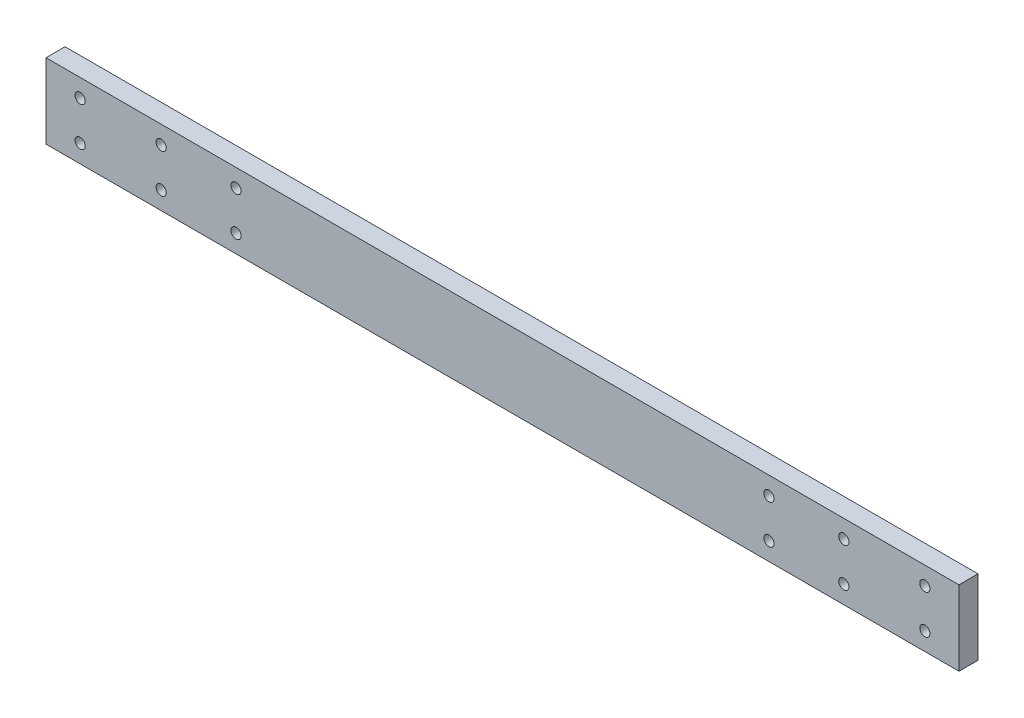
ISO-10303-21;
HEADER;
FILE_DESCRIPTION(('STEP AP214'),'2;1');
FILE_NAME('part.step','',(''),(''),'','','');
FILE_SCHEMA(('AUTOMOTIVE_DESIGN { 1 0 10303 214 1 1 1 1 }'));
ENDSEC;
DATA;
#1=APPLICATION_CONTEXT('core data for automotive mechanical design processes');
#2=APPLICATION_PROTOCOL_DEFINITION('international standard','automotive_design',2000,#1);
#3=PRODUCT_CONTEXT('',#1,'mechanical');
#4=PRODUCT('Part','Part','',(#3));
#5=PRODUCT_RELATED_PRODUCT_CATEGORY('part','',(#4));
#6=PRODUCT_DEFINITION_FORMATION('','',#4);
#7=PRODUCT_DEFINITION_CONTEXT('part definition',#1,'design');
#8=PRODUCT_DEFINITION('design','',#6,#7);
#9=PRODUCT_DEFINITION_SHAPE('','',#8);
#10=(LENGTH_UNIT() NAMED_UNIT(*) SI_UNIT(.MILLI.,.METRE.));
#11=(NAMED_UNIT(*) PLANE_ANGLE_UNIT() SI_UNIT($,.RADIAN.));
#12=(NAMED_UNIT(*) SI_UNIT($,.STERADIAN.) SOLID_ANGLE_UNIT());
#13=UNCERTAINTY_MEASURE_WITH_UNIT(LENGTH_MEASURE(1.E-05),#10,'distance_accuracy_value','');
#14=(GEOMETRIC_REPRESENTATION_CONTEXT(3) GLOBAL_UNCERTAINTY_ASSIGNED_CONTEXT((#13)) GLOBAL_UNIT_ASSIGNED_CONTEXT((#10,
#11,#12)) REPRESENTATION_CONTEXT('',''));
#15=CARTESIAN_POINT('',(0.,0.,0.));
#16=DIRECTION('',(0.,0.,1.));
#17=DIRECTION('',(1.,0.,0.));
#18=AXIS2_PLACEMENT_3D('',#15,#16,#17);
#19=CARTESIAN_POINT('',(264.023766162715,0.,6.35));
#20=DIRECTION('',(1.,0.,0.));
#21=DIRECTION('',(0.,0.,-1.));
#22=AXIS2_PLACEMENT_3D('',#19,#20,#21);
#23=PLANE('',#22);
#24=DIRECTION('',(0.,-1.,0.));
#25=VECTOR('',#24,1.);
#26=CARTESIAN_POINT('',(264.023766162715,0.,0.));
#27=LINE('',#26,#25);
#28=CARTESIAN_POINT('',(264.023766162715,235.923622409626,0.));
#29=VERTEX_POINT('',#28);
#30=CARTESIAN_POINT('',(264.023766162715,210.923622409626,0.));
#31=VERTEX_POINT('',#30);
#32=EDGE_CURVE('E103',#29,#31,#27,.T.);
#33=ORIENTED_EDGE('',*,*,#32,.F.);
#34=DIRECTION('',(0.,0.,-1.));
#35=VECTOR('',#34,1.);
#36=CARTESIAN_POINT('',(264.023766162715,235.923622409626,6.35));
#37=LINE('',#36,#35);
#38=CARTESIAN_POINT('',(264.023766162715,235.923622409626,6.35));
#39=VERTEX_POINT('',#38);
#40=EDGE_CURVE('E11',#39,#29,#37,.T.);
#41=ORIENTED_EDGE('',*,*,#40,.F.);
#42=DIRECTION('',(0.,-1.,0.));
#43=VECTOR('',#42,1.);
#44=CARTESIAN_POINT('',(264.023766162715,0.,6.35));
#45=LINE('',#44,#43);
#46=CARTESIAN_POINT('',(264.023766162715,210.923622409626,6.35));
#47=VERTEX_POINT('',#46);
#48=EDGE_CURVE('E96',#39,#47,#45,.T.);
#49=ORIENTED_EDGE('',*,*,#48,.T.);
#50=DIRECTION('',(0.,0.,-1.));
#51=VECTOR('',#50,1.);
#52=CARTESIAN_POINT('',(264.023766162715,210.923622409626,6.35));
#53=LINE('',#52,#51);
#54=EDGE_CURVE('E76',#47,#31,#53,.T.);
#55=ORIENTED_EDGE('',*,*,#54,.T.);
#56=EDGE_LOOP('',(#33,#41,#49,#55));
#57=FACE_BOUND('',#56,.T.);
#58=ADVANCED_FACE('F36',(#57),#23,.T.);
#59=CARTESIAN_POINT('',(0.,235.923622409626,6.35));
#60=DIRECTION('',(0.,1.,0.));
#61=DIRECTION('',(0.,0.,1.));
#62=AXIS2_PLACEMENT_3D('',#59,#60,#61);
#63=PLANE('',#62);
#64=DIRECTION('',(1.,0.,0.));
#65=VECTOR('',#64,1.);
#66=CARTESIAN_POINT('',(0.,235.923622409626,0.));
#67=LINE('',#66,#65);
#68=CARTESIAN_POINT('',(-40.7762338372855,235.923622409626,0.));
#69=VERTEX_POINT('',#68);
#70=EDGE_CURVE('E89',#69,#29,#67,.T.);
#71=ORIENTED_EDGE('',*,*,#70,.F.);
#72=DIRECTION('',(0.,0.,-1.));
#73=VECTOR('',#72,1.);
#74=CARTESIAN_POINT('',(-40.7762338372855,235.923622409626,6.35));
#75=LINE('',#74,#73);
#76=CARTESIAN_POINT('',(-40.7762338372855,235.923622409626,6.35));
#77=VERTEX_POINT('',#76);
#78=EDGE_CURVE('E45',#77,#69,#75,.T.);
#79=ORIENTED_EDGE('',*,*,#78,.F.);
#80=DIRECTION('',(1.,0.,0.));
#81=VECTOR('',#80,1.);
#82=CARTESIAN_POINT('',(0.,235.923622409626,6.35));
#83=LINE('',#82,#81);
#84=EDGE_CURVE('E87',#77,#39,#83,.T.);
#85=ORIENTED_EDGE('',*,*,#84,.T.);
#86=ORIENTED_EDGE('',*,*,#40,.T.);
#87=EDGE_LOOP('',(#71,#79,#85,#86));
#88=FACE_BOUND('',#87,.T.);
#89=ADVANCED_FACE('F85',(#88),#63,.T.);
#90=CARTESIAN_POINT('',(-40.7762338372855,0.,6.35));
#91=DIRECTION('',(1.,0.,0.));
#92=DIRECTION('',(0.,0.,-1.));
#93=AXIS2_PLACEMENT_3D('',#90,#91,#92);
#94=PLANE('',#93);
#95=DIRECTION('',(0.,-1.,0.));
#96=VECTOR('',#95,1.);
#97=CARTESIAN_POINT('',(-40.7762338372855,0.,0.));
#98=LINE('',#97,#96);
#99=CARTESIAN_POINT('',(-40.7762338372855,210.923622409626,0.));
#100=VERTEX_POINT('',#99);
#101=EDGE_CURVE('E69',#69,#100,#98,.T.);
#102=ORIENTED_EDGE('',*,*,#101,.T.);
#103=DIRECTION('',(0.,0.,-1.));
#104=VECTOR('',#103,1.);
#105=CARTESIAN_POINT('',(-40.7762338372855,210.923622409626,6.35));
#106=LINE('',#105,#104);
#107=CARTESIAN_POINT('',(-40.7762338372855,210.923622409626,6.35));
#108=VERTEX_POINT('',#107);
#109=EDGE_CURVE('E90',#108,#100,#106,.T.);
#110=ORIENTED_EDGE('',*,*,#109,.F.);
#111=DIRECTION('',(0.,-1.,0.));
#112=VECTOR('',#111,1.);
#113=CARTESIAN_POINT('',(-40.7762338372855,0.,6.35));
#114=LINE('',#113,#112);
#115=EDGE_CURVE('E92',#77,#108,#114,.T.);
#116=ORIENTED_EDGE('',*,*,#115,.F.);
#117=ORIENTED_EDGE('',*,*,#78,.T.);
#118=EDGE_LOOP('',(#102,#110,#116,#117));
#119=FACE_BOUND('',#118,.T.);
#120=ADVANCED_FACE('F93',(#119),#94,.F.);
#121=CARTESIAN_POINT('',(0.,210.923622409626,6.35));
#122=DIRECTION('',(0.,1.,0.));
#123=DIRECTION('',(0.,0.,1.));
#124=AXIS2_PLACEMENT_3D('',#121,#122,#123);
#125=PLANE('',#124);
#126=DIRECTION('',(1.,0.,0.));
#127=VECTOR('',#126,1.);
#128=CARTESIAN_POINT('',(0.,210.923622409626,0.));
#129=LINE('',#128,#127);
#130=EDGE_CURVE('E98',#100,#31,#129,.T.);
#131=ORIENTED_EDGE('',*,*,#130,.T.);
#132=ORIENTED_EDGE('',*,*,#54,.F.);
#133=DIRECTION('',(1.,0.,0.));
#134=VECTOR('',#133,1.);
#135=CARTESIAN_POINT('',(0.,210.923622409626,6.35));
#136=LINE('',#135,#134);
#137=EDGE_CURVE('E54',#108,#47,#136,.T.);
#138=ORIENTED_EDGE('',*,*,#137,.F.);
#139=ORIENTED_EDGE('',*,*,#109,.T.);
#140=EDGE_LOOP('',(#131,#132,#138,#139));
#141=FACE_BOUND('',#140,.T.);
#142=ADVANCED_FACE('F182',(#141),#125,.F.);
#143=CARTESIAN_POINT('',(0.,0.,6.35));
#144=DIRECTION('',(0.,0.,1.));
#145=DIRECTION('',(1.,0.,0.));
#146=AXIS2_PLACEMENT_3D('',#143,#144,#145);
#147=PLANE('',#146);
#148=CARTESIAN_POINT('',(22.6737661624925,229.923622409214,6.35));
#149=DIRECTION('',(0.,0.,1.));
#150=DIRECTION('',(1.,0.,0.));
#151=AXIS2_PLACEMENT_3D('',#148,#149,#150);
#152=CIRCLE('',#151,1.7);
#153=CARTESIAN_POINT('',(24.3737661624925,229.923622409214,6.35));
#154=VERTEX_POINT('',#153);
#155=EDGE_CURVE('E343',#154,#154,#152,.T.);
#156=ORIENTED_EDGE('',*,*,#155,.F.);
#157=EDGE_LOOP('',(#156));
#158=FACE_BOUND('',#157,.T.);
#159=CARTESIAN_POINT('',(200.573766162366,216.923622410467,6.35));
#160=DIRECTION('',(0.,0.,1.));
#161=DIRECTION('',(1.,0.,0.));
#162=AXIS2_PLACEMENT_3D('',#159,#160,#161);
#163=CIRCLE('',#162,1.69999999999999);
#164=CARTESIAN_POINT('',(202.273766162366,216.923622410467,6.35));
#165=VERTEX_POINT('',#164);
#166=EDGE_CURVE('E344',#165,#165,#163,.T.);
#167=ORIENTED_EDGE('',*,*,#166,.F.);
#168=EDGE_LOOP('',(#167));
#169=FACE_BOUND('',#168,.T.);
#170=CARTESIAN_POINT('',(200.573766162366,229.923622410467,6.35));
#171=DIRECTION('',(0.,0.,1.));
#172=DIRECTION('',(1.,0.,0.));
#173=AXIS2_PLACEMENT_3D('',#170,#171,#172);
#174=CIRCLE('',#173,1.69999999999999);
#175=CARTESIAN_POINT('',(202.273766162366,229.923622410467,6.35));
#176=VERTEX_POINT('',#175);
#177=EDGE_CURVE('E348',#176,#176,#174,.T.);
#178=ORIENTED_EDGE('',*,*,#177,.F.);
#179=EDGE_LOOP('',(#178));
#180=FACE_BOUND('',#179,.T.);
#181=CARTESIAN_POINT('',(22.6737661624925,216.923622409214,6.35));
#182=DIRECTION('',(0.,0.,1.));
#183=DIRECTION('',(1.,0.,0.));
#184=AXIS2_PLACEMENT_3D('',#181,#182,#183);
#185=CIRCLE('',#184,1.7);
#186=CARTESIAN_POINT('',(24.3737661624925,216.923622409214,6.35));
#187=VERTEX_POINT('',#186);
#188=EDGE_CURVE('E140',#187,#187,#185,.T.);
#189=ORIENTED_EDGE('',*,*,#188,.F.);
#190=EDGE_LOOP('',(#189));
#191=FACE_BOUND('',#190,.T.);
#192=CARTESIAN_POINT('',(252.623766162366,229.92362241078,6.35));
#193=DIRECTION('',(0.,0.,1.));
#194=DIRECTION('',(1.,0.,0.));
#195=AXIS2_PLACEMENT_3D('',#192,#193,#194);
#196=CIRCLE('',#195,1.69999999999996);
#197=CARTESIAN_POINT('',(254.323766162366,229.92362241078,6.35));
#198=VERTEX_POINT('',#197);
#199=EDGE_CURVE('E162',#198,#198,#196,.T.);
#200=ORIENTED_EDGE('',*,*,#199,.F.);
#201=EDGE_LOOP('',(#200));
#202=FACE_BOUND('',#201,.T.);
#203=CARTESIAN_POINT('',(-29.3762338375199,216.923622410265,6.35));
#204=DIRECTION('',(0.,0.,1.));
#205=DIRECTION('',(1.,0.,0.));
#206=AXIS2_PLACEMENT_3D('',#203,#204,#205);
#207=CIRCLE('',#206,1.69999999999998);
#208=CARTESIAN_POINT('',(-27.6762338375199,216.923622410265,6.35));
#209=VERTEX_POINT('',#208);
#210=EDGE_CURVE('E164',#209,#209,#207,.T.);
#211=ORIENTED_EDGE('',*,*,#210,.F.);
#212=EDGE_LOOP('',(#211));
#213=FACE_BOUND('',#212,.T.);
#214=CARTESIAN_POINT('',(-29.3762338375198,229.923622410266,6.35));
#215=DIRECTION('',(0.,0.,1.));
#216=DIRECTION('',(1.,0.,0.));
#217=AXIS2_PLACEMENT_3D('',#214,#215,#216);
#218=CIRCLE('',#217,1.69999999999998);
#219=CARTESIAN_POINT('',(-27.6762338375198,229.923622410266,6.35));
#220=VERTEX_POINT('',#219);
#221=EDGE_CURVE('E167',#220,#220,#218,.T.);
#222=ORIENTED_EDGE('',*,*,#221,.F.);
#223=EDGE_LOOP('',(#222));
#224=FACE_BOUND('',#223,.T.);
#225=CARTESIAN_POINT('',(-2.32623383751829,216.923622409221,6.35));
#226=DIRECTION('',(0.,0.,1.));
#227=DIRECTION('',(1.,0.,0.));
#228=AXIS2_PLACEMENT_3D('',#225,#226,#227);
#229=CIRCLE('',#228,1.69999999999998);
#230=CARTESIAN_POINT('',(-0.626233837518305,216.923622409221,6.35));
#231=VERTEX_POINT('',#230);
#232=EDGE_CURVE('E170',#231,#231,#229,.T.);
#233=ORIENTED_EDGE('',*,*,#232,.F.);
#234=EDGE_LOOP('',(#233));
#235=FACE_BOUND('',#234,.T.);
#236=CARTESIAN_POINT('',(225.573766162366,216.923622410467,6.35));
#237=DIRECTION('',(0.,0.,1.));
#238=DIRECTION('',(1.,0.,0.));
#239=AXIS2_PLACEMENT_3D('',#236,#237,#238);
#240=CIRCLE('',#239,1.69999999999999);
#241=CARTESIAN_POINT('',(227.273766162366,216.923622410467,6.35));
#242=VERTEX_POINT('',#241);
#243=EDGE_CURVE('E147',#242,#242,#240,.T.);
#244=ORIENTED_EDGE('',*,*,#243,.F.);
#245=EDGE_LOOP('',(#244));
#246=FACE_BOUND('',#245,.T.);
#247=CARTESIAN_POINT('',(225.573766162366,229.923622410467,6.35));
#248=DIRECTION('',(0.,0.,1.));
#249=DIRECTION('',(1.,0.,0.));
#250=AXIS2_PLACEMENT_3D('',#247,#248,#249);
#251=CIRCLE('',#250,1.69999999999999);
#252=CARTESIAN_POINT('',(227.273766162366,229.923622410467,6.35));
#253=VERTEX_POINT('',#252);
#254=EDGE_CURVE('E151',#253,#253,#251,.T.);
#255=ORIENTED_EDGE('',*,*,#254,.F.);
#256=EDGE_LOOP('',(#255));
#257=FACE_BOUND('',#256,.T.);
#258=CARTESIAN_POINT('',(252.623766162365,216.92362241078,6.35));
#259=DIRECTION('',(0.,0.,1.));
#260=DIRECTION('',(1.,0.,0.));
#261=AXIS2_PLACEMENT_3D('',#258,#259,#260);
#262=CIRCLE('',#261,1.69999999999996);
#263=CARTESIAN_POINT('',(254.323766162365,216.92362241078,6.35));
#264=VERTEX_POINT('',#263);
#265=EDGE_CURVE('E156',#264,#264,#262,.T.);
#266=ORIENTED_EDGE('',*,*,#265,.F.);
#267=EDGE_LOOP('',(#266));
#268=FACE_BOUND('',#267,.T.);
#269=CARTESIAN_POINT('',(-2.32623383751829,229.923622409221,6.35));
#270=DIRECTION('',(0.,0.,1.));
#271=DIRECTION('',(1.,0.,0.));
#272=AXIS2_PLACEMENT_3D('',#269,#270,#271);
#273=CIRCLE('',#272,1.69999999999998);
#274=CARTESIAN_POINT('',(-0.626233837518305,229.923622409221,6.35));
#275=VERTEX_POINT('',#274);
#276=EDGE_CURVE('E116',#275,#275,#273,.T.);
#277=ORIENTED_EDGE('',*,*,#276,.F.);
#278=EDGE_LOOP('',(#277));
#279=FACE_BOUND('',#278,.T.);
#280=ORIENTED_EDGE('',*,*,#48,.F.);
#281=ORIENTED_EDGE('',*,*,#84,.F.);
#282=ORIENTED_EDGE('',*,*,#115,.T.);
#283=ORIENTED_EDGE('',*,*,#137,.T.);
#284=EDGE_LOOP('',(#280,#281,#282,#283));
#285=FACE_BOUND('',#284,.T.);
#286=ADVANCED_FACE('F95',(#158,#169,#180,#191,#202,#213,#224,#235,#246,#257,#268,#279,#285),
#147,.T.);
#287=CARTESIAN_POINT('',(0.,0.,0.));
#288=DIRECTION('',(0.,0.,1.));
#289=DIRECTION('',(1.,0.,0.));
#290=AXIS2_PLACEMENT_3D('',#287,#288,#289);
#291=PLANE('',#290);
#292=CARTESIAN_POINT('',(22.6737661624925,229.923622409214,0.));
#293=DIRECTION('',(0.,0.,1.));
#294=DIRECTION('',(1.,0.,0.));
#295=AXIS2_PLACEMENT_3D('',#292,#293,#294);
#296=CIRCLE('',#295,1.7);
#297=CARTESIAN_POINT('',(24.3737661624925,229.923622409214,0.));
#298=VERTEX_POINT('',#297);
#299=EDGE_CURVE('E39',#298,#298,#296,.T.);
#300=ORIENTED_EDGE('',*,*,#299,.T.);
#301=EDGE_LOOP('',(#300));
#302=FACE_BOUND('',#301,.T.);
#303=CARTESIAN_POINT('',(200.573766162366,216.923622410467,0.));
#304=DIRECTION('',(0.,0.,1.));
#305=DIRECTION('',(1.,0.,0.));
#306=AXIS2_PLACEMENT_3D('',#303,#304,#305);
#307=CIRCLE('',#306,1.69999999999999);
#308=CARTESIAN_POINT('',(202.273766162366,216.923622410467,0.));
#309=VERTEX_POINT('',#308);
#310=EDGE_CURVE('E142',#309,#309,#307,.T.);
#311=ORIENTED_EDGE('',*,*,#310,.T.);
#312=EDGE_LOOP('',(#311));
#313=FACE_BOUND('',#312,.T.);
#314=CARTESIAN_POINT('',(200.573766162366,229.923622410467,0.));
#315=DIRECTION('',(0.,0.,1.));
#316=DIRECTION('',(1.,0.,0.));
#317=AXIS2_PLACEMENT_3D('',#314,#315,#316);
#318=CIRCLE('',#317,1.69999999999999);
#319=CARTESIAN_POINT('',(202.273766162366,229.923622410467,0.));
#320=VERTEX_POINT('',#319);
#321=EDGE_CURVE('E139',#320,#320,#318,.T.);
#322=ORIENTED_EDGE('',*,*,#321,.T.);
#323=EDGE_LOOP('',(#322));
#324=FACE_BOUND('',#323,.T.);
#325=CARTESIAN_POINT('',(22.6737661624925,216.923622409214,0.));
#326=DIRECTION('',(0.,0.,1.));
#327=DIRECTION('',(1.,0.,0.));
#328=AXIS2_PLACEMENT_3D('',#325,#326,#327);
#329=CIRCLE('',#328,1.7);
#330=CARTESIAN_POINT('',(24.3737661624925,216.923622409214,0.));
#331=VERTEX_POINT('',#330);
#332=EDGE_CURVE('E136',#331,#331,#329,.T.);
#333=ORIENTED_EDGE('',*,*,#332,.T.);
#334=EDGE_LOOP('',(#333));
#335=FACE_BOUND('',#334,.T.);
#336=CARTESIAN_POINT('',(252.623766162366,229.92362241078,0.));
#337=DIRECTION('',(0.,0.,1.));
#338=DIRECTION('',(1.,0.,0.));
#339=AXIS2_PLACEMENT_3D('',#336,#337,#338);
#340=CIRCLE('',#339,1.69999999999996);
#341=CARTESIAN_POINT('',(254.323766162366,229.92362241078,0.));
#342=VERTEX_POINT('',#341);
#343=EDGE_CURVE('E106',#342,#342,#340,.T.);
#344=ORIENTED_EDGE('',*,*,#343,.T.);
#345=EDGE_LOOP('',(#344));
#346=FACE_BOUND('',#345,.T.);
#347=CARTESIAN_POINT('',(-29.3762338375199,216.923622410265,0.));
#348=DIRECTION('',(0.,0.,1.));
#349=DIRECTION('',(1.,0.,0.));
#350=AXIS2_PLACEMENT_3D('',#347,#348,#349);
#351=CIRCLE('',#350,1.69999999999998);
#352=CARTESIAN_POINT('',(-27.6762338375199,216.923622410265,0.));
#353=VERTEX_POINT('',#352);
#354=EDGE_CURVE('E131',#353,#353,#351,.T.);
#355=ORIENTED_EDGE('',*,*,#354,.T.);
#356=EDGE_LOOP('',(#355));
#357=FACE_BOUND('',#356,.T.);
#358=CARTESIAN_POINT('',(-29.3762338375198,229.923622410266,0.));
#359=DIRECTION('',(0.,0.,1.));
#360=DIRECTION('',(1.,0.,0.));
#361=AXIS2_PLACEMENT_3D('',#358,#359,#360);
#362=CIRCLE('',#361,1.69999999999998);
#363=CARTESIAN_POINT('',(-27.6762338375198,229.923622410266,0.));
#364=VERTEX_POINT('',#363);
#365=EDGE_CURVE('E128',#364,#364,#362,.T.);
#366=ORIENTED_EDGE('',*,*,#365,.T.);
#367=EDGE_LOOP('',(#366));
#368=FACE_BOUND('',#367,.T.);
#369=CARTESIAN_POINT('',(-2.32623383751829,216.923622409221,0.));
#370=DIRECTION('',(0.,0.,1.));
#371=DIRECTION('',(1.,0.,0.));
#372=AXIS2_PLACEMENT_3D('',#369,#370,#371);
#373=CIRCLE('',#372,1.69999999999998);
#374=CARTESIAN_POINT('',(-0.626233837518305,216.923622409221,0.));
#375=VERTEX_POINT('',#374);
#376=EDGE_CURVE('E125',#375,#375,#373,.T.);
#377=ORIENTED_EDGE('',*,*,#376,.T.);
#378=EDGE_LOOP('',(#377));
#379=FACE_BOUND('',#378,.T.);
#380=CARTESIAN_POINT('',(225.573766162366,216.923622410467,0.));
#381=DIRECTION('',(0.,0.,1.));
#382=DIRECTION('',(1.,0.,0.));
#383=AXIS2_PLACEMENT_3D('',#380,#381,#382);
#384=CIRCLE('',#383,1.69999999999999);
#385=CARTESIAN_POINT('',(227.273766162366,216.923622410467,0.));
#386=VERTEX_POINT('',#385);
#387=EDGE_CURVE('E122',#386,#386,#384,.T.);
#388=ORIENTED_EDGE('',*,*,#387,.T.);
#389=EDGE_LOOP('',(#388));
#390=FACE_BOUND('',#389,.T.);
#391=CARTESIAN_POINT('',(225.573766162366,229.923622410467,0.));
#392=DIRECTION('',(0.,0.,1.));
#393=DIRECTION('',(1.,0.,0.));
#394=AXIS2_PLACEMENT_3D('',#391,#392,#393);
#395=CIRCLE('',#394,1.69999999999999);
#396=CARTESIAN_POINT('',(227.273766162366,229.923622410467,0.));
#397=VERTEX_POINT('',#396);
#398=EDGE_CURVE('E119',#397,#397,#395,.T.);
#399=ORIENTED_EDGE('',*,*,#398,.T.);
#400=EDGE_LOOP('',(#399));
#401=FACE_BOUND('',#400,.T.);
#402=CARTESIAN_POINT('',(252.623766162365,216.92362241078,0.));
#403=DIRECTION('',(0.,0.,1.));
#404=DIRECTION('',(1.,0.,0.));
#405=AXIS2_PLACEMENT_3D('',#402,#403,#404);
#406=CIRCLE('',#405,1.69999999999996);
#407=CARTESIAN_POINT('',(254.323766162365,216.92362241078,0.));
#408=VERTEX_POINT('',#407);
#409=EDGE_CURVE('E115',#408,#408,#406,.T.);
#410=ORIENTED_EDGE('',*,*,#409,.T.);
#411=EDGE_LOOP('',(#410));
#412=FACE_BOUND('',#411,.T.);
#413=CARTESIAN_POINT('',(-2.32623383751829,229.923622409221,0.));
#414=DIRECTION('',(0.,0.,1.));
#415=DIRECTION('',(1.,0.,0.));
#416=AXIS2_PLACEMENT_3D('',#413,#414,#415);
#417=CIRCLE('',#416,1.69999999999998);
#418=CARTESIAN_POINT('',(-0.626233837518305,229.923622409221,0.));
#419=VERTEX_POINT('',#418);
#420=EDGE_CURVE('E112',#419,#419,#417,.T.);
#421=ORIENTED_EDGE('',*,*,#420,.T.);
#422=EDGE_LOOP('',(#421));
#423=FACE_BOUND('',#422,.T.);
#424=ORIENTED_EDGE('',*,*,#32,.T.);
#425=ORIENTED_EDGE('',*,*,#130,.F.);
#426=ORIENTED_EDGE('',*,*,#101,.F.);
#427=ORIENTED_EDGE('',*,*,#70,.T.);
#428=EDGE_LOOP('',(#424,#425,#426,#427));
#429=FACE_BOUND('',#428,.T.);
#430=ADVANCED_FACE('F181',(#302,#313,#324,#335,#346,#357,#368,#379,#390,#401,#412,#423,#429),
#291,.F.);
#431=CARTESIAN_POINT('',(-2.32623383751829,229.923622409221,-23.65));
#432=DIRECTION('',(0.,0.,1.));
#433=DIRECTION('',(1.,0.,0.));
#434=AXIS2_PLACEMENT_3D('',#431,#432,#433);
#435=CYLINDRICAL_SURFACE('',#434,1.69999999999998);
#436=ORIENTED_EDGE('',*,*,#276,.T.);
#437=EDGE_LOOP('',(#436));
#438=FACE_BOUND('',#437,.T.);
#439=ORIENTED_EDGE('',*,*,#420,.F.);
#440=EDGE_LOOP('',(#439));
#441=FACE_BOUND('',#440,.T.);
#442=ADVANCED_FACE('F177',(#438,#441),#435,.F.);
#443=CARTESIAN_POINT('',(252.623766162365,216.92362241078,-23.65));
#444=DIRECTION('',(0.,0.,1.));
#445=DIRECTION('',(1.,0.,0.));
#446=AXIS2_PLACEMENT_3D('',#443,#444,#445);
#447=CYLINDRICAL_SURFACE('',#446,1.69999999999996);
#448=ORIENTED_EDGE('',*,*,#265,.T.);
#449=EDGE_LOOP('',(#448));
#450=FACE_BOUND('',#449,.T.);
#451=ORIENTED_EDGE('',*,*,#409,.F.);
#452=EDGE_LOOP('',(#451));
#453=FACE_BOUND('',#452,.T.);
#454=ADVANCED_FACE('F221',(#450,#453),#447,.F.);
#455=CARTESIAN_POINT('',(225.573766162366,229.923622410467,-23.65));
#456=DIRECTION('',(0.,0.,1.));
#457=DIRECTION('',(1.,0.,0.));
#458=AXIS2_PLACEMENT_3D('',#455,#456,#457);
#459=CYLINDRICAL_SURFACE('',#458,1.69999999999999);
#460=ORIENTED_EDGE('',*,*,#254,.T.);
#461=EDGE_LOOP('',(#460));
#462=FACE_BOUND('',#461,.T.);
#463=ORIENTED_EDGE('',*,*,#398,.F.);
#464=EDGE_LOOP('',(#463));
#465=FACE_BOUND('',#464,.T.);
#466=ADVANCED_FACE('F230',(#462,#465),#459,.F.);
#467=CARTESIAN_POINT('',(225.573766162366,216.923622410467,-23.65));
#468=DIRECTION('',(0.,0.,1.));
#469=DIRECTION('',(1.,0.,0.));
#470=AXIS2_PLACEMENT_3D('',#467,#468,#469);
#471=CYLINDRICAL_SURFACE('',#470,1.69999999999999);
#472=ORIENTED_EDGE('',*,*,#243,.T.);
#473=EDGE_LOOP('',(#472));
#474=FACE_BOUND('',#473,.T.);
#475=ORIENTED_EDGE('',*,*,#387,.F.);
#476=EDGE_LOOP('',(#475));
#477=FACE_BOUND('',#476,.T.);
#478=ADVANCED_FACE('F240',(#474,#477),#471,.F.);
#479=CARTESIAN_POINT('',(-2.32623383751829,216.923622409221,-23.65));
#480=DIRECTION('',(0.,0.,1.));
#481=DIRECTION('',(1.,0.,0.));
#482=AXIS2_PLACEMENT_3D('',#479,#480,#481);
#483=CYLINDRICAL_SURFACE('',#482,1.69999999999998);
#484=ORIENTED_EDGE('',*,*,#232,.T.);
#485=EDGE_LOOP('',(#484));
#486=FACE_BOUND('',#485,.T.);
#487=ORIENTED_EDGE('',*,*,#376,.F.);
#488=EDGE_LOOP('',(#487));
#489=FACE_BOUND('',#488,.T.);
#490=ADVANCED_FACE('F250',(#486,#489),#483,.F.);
#491=CARTESIAN_POINT('',(-29.3762338375198,229.923622410266,-23.65));
#492=DIRECTION('',(0.,0.,1.));
#493=DIRECTION('',(1.,0.,0.));
#494=AXIS2_PLACEMENT_3D('',#491,#492,#493);
#495=CYLINDRICAL_SURFACE('',#494,1.69999999999998);
#496=ORIENTED_EDGE('',*,*,#221,.T.);
#497=EDGE_LOOP('',(#496));
#498=FACE_BOUND('',#497,.T.);
#499=ORIENTED_EDGE('',*,*,#365,.F.);
#500=EDGE_LOOP('',(#499));
#501=FACE_BOUND('',#500,.T.);
#502=ADVANCED_FACE('F259',(#498,#501),#495,.F.);
#503=CARTESIAN_POINT('',(-29.3762338375199,216.923622410265,-23.65));
#504=DIRECTION('',(0.,0.,1.));
#505=DIRECTION('',(1.,0.,0.));
#506=AXIS2_PLACEMENT_3D('',#503,#504,#505);
#507=CYLINDRICAL_SURFACE('',#506,1.69999999999998);
#508=ORIENTED_EDGE('',*,*,#210,.T.);
#509=EDGE_LOOP('',(#508));
#510=FACE_BOUND('',#509,.T.);
#511=ORIENTED_EDGE('',*,*,#354,.F.);
#512=EDGE_LOOP('',(#511));
#513=FACE_BOUND('',#512,.T.);
#514=ADVANCED_FACE('F269',(#510,#513),#507,.F.);
#515=CARTESIAN_POINT('',(252.623766162366,229.92362241078,-23.65));
#516=DIRECTION('',(0.,0.,1.));
#517=DIRECTION('',(1.,0.,0.));
#518=AXIS2_PLACEMENT_3D('',#515,#516,#517);
#519=CYLINDRICAL_SURFACE('',#518,1.69999999999996);
#520=ORIENTED_EDGE('',*,*,#199,.T.);
#521=EDGE_LOOP('',(#520));
#522=FACE_BOUND('',#521,.T.);
#523=ORIENTED_EDGE('',*,*,#343,.F.);
#524=EDGE_LOOP('',(#523));
#525=FACE_BOUND('',#524,.T.);
#526=ADVANCED_FACE('F279',(#522,#525),#519,.F.);
#527=CARTESIAN_POINT('',(22.6737661624925,216.923622409214,-14.65));
#528=DIRECTION('',(0.,0.,1.));
#529=DIRECTION('',(1.,0.,0.));
#530=AXIS2_PLACEMENT_3D('',#527,#528,#529);
#531=CYLINDRICAL_SURFACE('',#530,1.7);
#532=CARTESIAN_POINT('',(24.3737661624925,216.923622409214,6.35));
#533=CARTESIAN_POINT('',(24.3737661624925,216.923622409214,6.28385416666667));
#534=CARTESIAN_POINT('',(24.3737661624925,216.923622409214,6.21770833333333));
#535=CARTESIAN_POINT('',(24.3737661624925,216.923622409214,6.08541666666667));
#536=CARTESIAN_POINT('',(24.3737661624925,216.923622409214,6.01927083333333));
#537=CARTESIAN_POINT('',(24.3737661624925,216.923622409214,5.88697916666667));
#538=CARTESIAN_POINT('',(24.3737661624925,216.923622409214,5.82083333333333));
#539=CARTESIAN_POINT('',(24.3737661624925,216.923622409214,5.68854166666667));
#540=CARTESIAN_POINT('',(24.3737661624925,216.923622409214,5.62239583333333));
#541=CARTESIAN_POINT('',(24.3737661624925,216.923622409214,5.49010416666667));
#542=CARTESIAN_POINT('',(24.3737661624925,216.923622409214,5.42395833333333));
#543=CARTESIAN_POINT('',(24.3737661624925,216.923622409214,5.29166666666667));
#544=CARTESIAN_POINT('',(24.3737661624925,216.923622409214,5.22552083333333));
#545=CARTESIAN_POINT('',(24.3737661624925,216.923622409214,5.09322916666667));
#546=CARTESIAN_POINT('',(24.3737661624925,216.923622409214,5.02708333333333));
#547=CARTESIAN_POINT('',(24.3737661624925,216.923622409214,4.89479166666667));
#548=CARTESIAN_POINT('',(24.3737661624925,216.923622409214,4.82864583333333));
#549=CARTESIAN_POINT('',(24.3737661624925,216.923622409214,4.69635416666667));
#550=CARTESIAN_POINT('',(24.3737661624925,216.923622409214,4.63020833333333));
#551=CARTESIAN_POINT('',(24.3737661624925,216.923622409214,4.49791666666667));
#552=CARTESIAN_POINT('',(24.3737661624925,216.923622409214,4.43177083333333));
#553=CARTESIAN_POINT('',(24.3737661624925,216.923622409214,4.29947916666667));
#554=CARTESIAN_POINT('',(24.3737661624925,216.923622409214,4.23333333333333));
#555=CARTESIAN_POINT('',(24.3737661624925,216.923622409214,4.10104166666667));
#556=CARTESIAN_POINT('',(24.3737661624925,216.923622409214,4.03489583333333));
#557=CARTESIAN_POINT('',(24.3737661624925,216.923622409214,3.90260416666667));
#558=CARTESIAN_POINT('',(24.3737661624925,216.923622409214,3.83645833333333));
#559=CARTESIAN_POINT('',(24.3737661624925,216.923622409214,3.70416666666667));
#560=CARTESIAN_POINT('',(24.3737661624925,216.923622409214,3.63802083333333));
#561=CARTESIAN_POINT('',(24.3737661624925,216.923622409214,3.50572916666667));
#562=CARTESIAN_POINT('',(24.3737661624925,216.923622409214,3.43958333333333));
#563=CARTESIAN_POINT('',(24.3737661624925,216.923622409214,3.30729166666667));
#564=CARTESIAN_POINT('',(24.3737661624925,216.923622409214,3.24114583333333));
#565=CARTESIAN_POINT('',(24.3737661624925,216.923622409214,3.10885416666667));
#566=CARTESIAN_POINT('',(24.3737661624925,216.923622409214,3.04270833333333));
#567=CARTESIAN_POINT('',(24.3737661624925,216.923622409214,2.91041666666667));
#568=CARTESIAN_POINT('',(24.3737661624925,216.923622409214,2.84427083333333));
#569=CARTESIAN_POINT('',(24.3737661624925,216.923622409214,2.71197916666666));
#570=CARTESIAN_POINT('',(24.3737661624925,216.923622409214,2.64583333333333));
#571=CARTESIAN_POINT('',(24.3737661624925,216.923622409214,2.51354166666667));
#572=CARTESIAN_POINT('',(24.3737661624925,216.923622409214,2.44739583333333));
#573=CARTESIAN_POINT('',(24.3737661624925,216.923622409214,2.31510416666667));
#574=CARTESIAN_POINT('',(24.3737661624925,216.923622409214,2.24895833333333));
#575=CARTESIAN_POINT('',(24.3737661624925,216.923622409214,2.11666666666666));
#576=CARTESIAN_POINT('',(24.3737661624925,216.923622409214,2.05052083333333));
#577=CARTESIAN_POINT('',(24.3737661624925,216.923622409214,1.91822916666667));
#578=CARTESIAN_POINT('',(24.3737661624925,216.923622409214,1.85208333333333));
#579=CARTESIAN_POINT('',(24.3737661624925,216.923622409214,1.71979166666667));
#580=CARTESIAN_POINT('',(24.3737661624925,216.923622409214,1.65364583333333));
#581=CARTESIAN_POINT('',(24.3737661624925,216.923622409214,1.52135416666666));
#582=CARTESIAN_POINT('',(24.3737661624925,216.923622409214,1.45520833333333));
#583=CARTESIAN_POINT('',(24.3737661624925,216.923622409214,1.32291666666666));
#584=CARTESIAN_POINT('',(24.3737661624925,216.923622409214,1.25677083333333));
#585=CARTESIAN_POINT('',(24.3737661624925,216.923622409214,1.12447916666666));
#586=CARTESIAN_POINT('',(24.3737661624925,216.923622409214,1.05833333333333));
#587=CARTESIAN_POINT('',(24.3737661624925,216.923622409214,0.926041666666664));
#588=CARTESIAN_POINT('',(24.3737661624925,216.923622409214,0.859895833333332));
#589=CARTESIAN_POINT('',(24.3737661624925,216.923622409214,0.727604166666666));
#590=CARTESIAN_POINT('',(24.3737661624925,216.923622409214,0.661458333333333));
#591=CARTESIAN_POINT('',(24.3737661624925,216.923622409214,0.529166666666667));
#592=CARTESIAN_POINT('',(24.3737661624925,216.923622409214,0.463020833333333));
#593=CARTESIAN_POINT('',(24.3737661624925,216.923622409214,0.330729166666666));
#594=CARTESIAN_POINT('',(24.3737661624925,216.923622409214,0.264583333333333));
#595=CARTESIAN_POINT('',(24.3737661624925,216.923622409214,0.132291666666666));
#596=CARTESIAN_POINT('',(24.3737661624925,216.923622409214,0.066145833333333));
#597=CARTESIAN_POINT('',(24.3737661624925,216.923622409214,0.));
#598=B_SPLINE_CURVE_WITH_KNOTS('',3,(#532,#533,#534,#535,#536,#537,#538,#539,#540,#541,#542,
#543,#544,#545,#546,#547,#548,#549,#550,#551,#552,#553,#554,#555,#556,#557,#558,#559,#560,#561,
#562,#563,#564,#565,#566,#567,#568,#569,#570,#571,#572,#573,#574,#575,#576,#577,#578,#579,#580,
#581,#582,#583,#584,#585,#586,#587,#588,#589,#590,#591,#592,#593,#594,#595,#596,#597),
.UNSPECIFIED.,.F.,.F.,(4,2,2,2,2,2,2,2,2,2,2,2,2,2,2,2,2,2,2,2,2,2,2,2,2,2,2,2,2,2,2,2,4),(0.,
0.198437499999999,0.396875000000001,0.5953125,0.793749999999999,0.992187500000002,1.190625,
1.3890625,1.5875,1.7859375,1.984375,2.1828125,2.38125,2.5796875,2.778125,2.9765625,3.175,
3.3734375,3.571875,3.7703125,3.96875,4.1671875,4.365625,4.5640625,4.7625,4.9609375,5.159375,
5.3578125,5.55625,5.7546875,5.953125,6.1515625,6.35),.UNSPECIFIED.);
#599=EDGE_CURVE('BSEAM288',#187,#331,#598,.T.);
#600=ORIENTED_EDGE('',*,*,#188,.T.);
#601=ORIENTED_EDGE('',*,*,#332,.F.);
#602=ORIENTED_EDGE('',*,*,#599,.T.);
#603=ORIENTED_EDGE('',*,*,#599,.F.);
#604=EDGE_LOOP('',(#600,#602,#601,#603));
#605=FACE_BOUND('',#604,.T.);
#606=ADVANCED_FACE('F288',(#605),#531,.F.);
#607=CARTESIAN_POINT('',(200.573766162366,229.923622410467,-14.65));
#608=DIRECTION('',(0.,0.,1.));
#609=DIRECTION('',(1.,0.,0.));
#610=AXIS2_PLACEMENT_3D('',#607,#608,#609);
#611=CYLINDRICAL_SURFACE('',#610,1.69999999999999);
#612=CARTESIAN_POINT('',(202.273766162366,229.923622410467,6.35));
#613=CARTESIAN_POINT('',(202.273766162366,229.923622410467,6.28385416666667));
#614=CARTESIAN_POINT('',(202.273766162366,229.923622410467,6.21770833333333));
#615=CARTESIAN_POINT('',(202.273766162366,229.923622410467,6.08541666666667));
#616=CARTESIAN_POINT('',(202.273766162366,229.923622410467,6.01927083333333));
#617=CARTESIAN_POINT('',(202.273766162366,229.923622410467,5.88697916666667));
#618=CARTESIAN_POINT('',(202.273766162366,229.923622410467,5.82083333333333));
#619=CARTESIAN_POINT('',(202.273766162366,229.923622410467,5.68854166666667));
#620=CARTESIAN_POINT('',(202.273766162366,229.923622410467,5.62239583333333));
#621=CARTESIAN_POINT('',(202.273766162366,229.923622410467,5.49010416666667));
#622=CARTESIAN_POINT('',(202.273766162366,229.923622410467,5.42395833333333));
#623=CARTESIAN_POINT('',(202.273766162366,229.923622410467,5.29166666666667));
#624=CARTESIAN_POINT('',(202.273766162366,229.923622410467,5.22552083333333));
#625=CARTESIAN_POINT('',(202.273766162366,229.923622410467,5.09322916666667));
#626=CARTESIAN_POINT('',(202.273766162366,229.923622410467,5.02708333333333));
#627=CARTESIAN_POINT('',(202.273766162366,229.923622410467,4.89479166666667));
#628=CARTESIAN_POINT('',(202.273766162366,229.923622410467,4.82864583333333));
#629=CARTESIAN_POINT('',(202.273766162366,229.923622410467,4.69635416666667));
#630=CARTESIAN_POINT('',(202.273766162366,229.923622410467,4.63020833333333));
#631=CARTESIAN_POINT('',(202.273766162366,229.923622410467,4.49791666666667));
#632=CARTESIAN_POINT('',(202.273766162366,229.923622410467,4.43177083333333));
#633=CARTESIAN_POINT('',(202.273766162366,229.923622410467,4.29947916666667));
#634=CARTESIAN_POINT('',(202.273766162366,229.923622410467,4.23333333333333));
#635=CARTESIAN_POINT('',(202.273766162366,229.923622410467,4.10104166666667));
#636=CARTESIAN_POINT('',(202.273766162366,229.923622410467,4.03489583333333));
#637=CARTESIAN_POINT('',(202.273766162366,229.923622410467,3.90260416666667));
#638=CARTESIAN_POINT('',(202.273766162366,229.923622410467,3.83645833333333));
#639=CARTESIAN_POINT('',(202.273766162366,229.923622410467,3.70416666666667));
#640=CARTESIAN_POINT('',(202.273766162366,229.923622410467,3.63802083333333));
#641=CARTESIAN_POINT('',(202.273766162366,229.923622410467,3.50572916666667));
#642=CARTESIAN_POINT('',(202.273766162366,229.923622410467,3.43958333333333));
#643=CARTESIAN_POINT('',(202.273766162366,229.923622410467,3.30729166666667));
#644=CARTESIAN_POINT('',(202.273766162366,229.923622410467,3.24114583333333));
#645=CARTESIAN_POINT('',(202.273766162366,229.923622410467,3.10885416666667));
#646=CARTESIAN_POINT('',(202.273766162366,229.923622410467,3.04270833333333));
#647=CARTESIAN_POINT('',(202.273766162366,229.923622410467,2.91041666666667));
#648=CARTESIAN_POINT('',(202.273766162366,229.923622410467,2.84427083333333));
#649=CARTESIAN_POINT('',(202.273766162366,229.923622410467,2.71197916666666));
#650=CARTESIAN_POINT('',(202.273766162366,229.923622410467,2.64583333333333));
#651=CARTESIAN_POINT('',(202.273766162366,229.923622410467,2.51354166666667));
#652=CARTESIAN_POINT('',(202.273766162366,229.923622410467,2.44739583333333));
#653=CARTESIAN_POINT('',(202.273766162366,229.923622410467,2.31510416666667));
#654=CARTESIAN_POINT('',(202.273766162366,229.923622410467,2.24895833333333));
#655=CARTESIAN_POINT('',(202.273766162366,229.923622410467,2.11666666666666));
#656=CARTESIAN_POINT('',(202.273766162366,229.923622410467,2.05052083333333));
#657=CARTESIAN_POINT('',(202.273766162366,229.923622410467,1.91822916666667));
#658=CARTESIAN_POINT('',(202.273766162366,229.923622410467,1.85208333333333));
#659=CARTESIAN_POINT('',(202.273766162366,229.923622410467,1.71979166666667));
#660=CARTESIAN_POINT('',(202.273766162366,229.923622410467,1.65364583333333));
#661=CARTESIAN_POINT('',(202.273766162366,229.923622410467,1.52135416666666));
#662=CARTESIAN_POINT('',(202.273766162366,229.923622410467,1.45520833333333));
#663=CARTESIAN_POINT('',(202.273766162366,229.923622410467,1.32291666666666));
#664=CARTESIAN_POINT('',(202.273766162366,229.923622410467,1.25677083333333));
#665=CARTESIAN_POINT('',(202.273766162366,229.923622410467,1.12447916666666));
#666=CARTESIAN_POINT('',(202.273766162366,229.923622410467,1.05833333333333));
#667=CARTESIAN_POINT('',(202.273766162366,229.923622410467,0.926041666666664));
#668=CARTESIAN_POINT('',(202.273766162366,229.923622410467,0.859895833333332));
#669=CARTESIAN_POINT('',(202.273766162366,229.923622410467,0.727604166666666));
#670=CARTESIAN_POINT('',(202.273766162366,229.923622410467,0.661458333333333));
#671=CARTESIAN_POINT('',(202.273766162366,229.923622410467,0.529166666666667));
#672=CARTESIAN_POINT('',(202.273766162366,229.923622410467,0.463020833333333));
#673=CARTESIAN_POINT('',(202.273766162366,229.923622410467,0.330729166666666));
#674=CARTESIAN_POINT('',(202.273766162366,229.923622410467,0.264583333333333));
#675=CARTESIAN_POINT('',(202.273766162366,229.923622410467,0.132291666666666));
#676=CARTESIAN_POINT('',(202.273766162366,229.923622410467,0.066145833333333));
#677=CARTESIAN_POINT('',(202.273766162366,229.923622410467,0.));
#678=B_SPLINE_CURVE_WITH_KNOTS('',3,(#612,#613,#614,#615,#616,#617,#618,#619,#620,#621,#622,
#623,#624,#625,#626,#627,#628,#629,#630,#631,#632,#633,#634,#635,#636,#637,#638,#639,#640,#641,
#642,#643,#644,#645,#646,#647,#648,#649,#650,#651,#652,#653,#654,#655,#656,#657,#658,#659,#660,
#661,#662,#663,#664,#665,#666,#667,#668,#669,#670,#671,#672,#673,#674,#675,#676,#677),
.UNSPECIFIED.,.F.,.F.,(4,2,2,2,2,2,2,2,2,2,2,2,2,2,2,2,2,2,2,2,2,2,2,2,2,2,2,2,2,2,2,2,4),(0.,
0.198437499999999,0.396875000000001,0.5953125,0.793749999999999,0.992187500000002,1.190625,
1.3890625,1.5875,1.7859375,1.984375,2.1828125,2.38125,2.5796875,2.778125,2.9765625,3.175,
3.3734375,3.571875,3.7703125,3.96875,4.1671875,4.365625,4.5640625,4.7625,4.9609375,5.159375,
5.3578125,5.55625,5.7546875,5.953125,6.1515625,6.35),.UNSPECIFIED.);
#679=EDGE_CURVE('BSEAM307',#176,#320,#678,.T.);
#680=ORIENTED_EDGE('',*,*,#177,.T.);
#681=ORIENTED_EDGE('',*,*,#321,.F.);
#682=ORIENTED_EDGE('',*,*,#679,.T.);
#683=ORIENTED_EDGE('',*,*,#679,.F.);
#684=EDGE_LOOP('',(#680,#682,#681,#683));
#685=FACE_BOUND('',#684,.T.);
#686=ADVANCED_FACE('F307',(#685),#611,.F.);
#687=CARTESIAN_POINT('',(200.573766162366,216.923622410467,-14.65));
#688=DIRECTION('',(0.,0.,1.));
#689=DIRECTION('',(1.,0.,0.));
#690=AXIS2_PLACEMENT_3D('',#687,#688,#689);
#691=CYLINDRICAL_SURFACE('',#690,1.69999999999999);
#692=CARTESIAN_POINT('',(202.273766162366,216.923622410467,6.35));
#693=CARTESIAN_POINT('',(202.273766162366,216.923622410467,6.28385416666667));
#694=CARTESIAN_POINT('',(202.273766162366,216.923622410467,6.21770833333333));
#695=CARTESIAN_POINT('',(202.273766162366,216.923622410467,6.08541666666667));
#696=CARTESIAN_POINT('',(202.273766162366,216.923622410467,6.01927083333333));
#697=CARTESIAN_POINT('',(202.273766162366,216.923622410467,5.88697916666667));
#698=CARTESIAN_POINT('',(202.273766162366,216.923622410467,5.82083333333333));
#699=CARTESIAN_POINT('',(202.273766162366,216.923622410467,5.68854166666667));
#700=CARTESIAN_POINT('',(202.273766162366,216.923622410467,5.62239583333333));
#701=CARTESIAN_POINT('',(202.273766162366,216.923622410467,5.49010416666667));
#702=CARTESIAN_POINT('',(202.273766162366,216.923622410467,5.42395833333333));
#703=CARTESIAN_POINT('',(202.273766162366,216.923622410467,5.29166666666667));
#704=CARTESIAN_POINT('',(202.273766162366,216.923622410467,5.22552083333333));
#705=CARTESIAN_POINT('',(202.273766162366,216.923622410467,5.09322916666667));
#706=CARTESIAN_POINT('',(202.273766162366,216.923622410467,5.02708333333333));
#707=CARTESIAN_POINT('',(202.273766162366,216.923622410467,4.89479166666667));
#708=CARTESIAN_POINT('',(202.273766162366,216.923622410467,4.82864583333333));
#709=CARTESIAN_POINT('',(202.273766162366,216.923622410467,4.69635416666667));
#710=CARTESIAN_POINT('',(202.273766162366,216.923622410467,4.63020833333333));
#711=CARTESIAN_POINT('',(202.273766162366,216.923622410467,4.49791666666667));
#712=CARTESIAN_POINT('',(202.273766162366,216.923622410467,4.43177083333333));
#713=CARTESIAN_POINT('',(202.273766162366,216.923622410467,4.29947916666667));
#714=CARTESIAN_POINT('',(202.273766162366,216.923622410467,4.23333333333333));
#715=CARTESIAN_POINT('',(202.273766162366,216.923622410467,4.10104166666667));
#716=CARTESIAN_POINT('',(202.273766162366,216.923622410467,4.03489583333333));
#717=CARTESIAN_POINT('',(202.273766162366,216.923622410467,3.90260416666667));
#718=CARTESIAN_POINT('',(202.273766162366,216.923622410467,3.83645833333333));
#719=CARTESIAN_POINT('',(202.273766162366,216.923622410467,3.70416666666667));
#720=CARTESIAN_POINT('',(202.273766162366,216.923622410467,3.63802083333333));
#721=CARTESIAN_POINT('',(202.273766162366,216.923622410467,3.50572916666667));
#722=CARTESIAN_POINT('',(202.273766162366,216.923622410467,3.43958333333333));
#723=CARTESIAN_POINT('',(202.273766162366,216.923622410467,3.30729166666667));
#724=CARTESIAN_POINT('',(202.273766162366,216.923622410467,3.24114583333333));
#725=CARTESIAN_POINT('',(202.273766162366,216.923622410467,3.10885416666667));
#726=CARTESIAN_POINT('',(202.273766162366,216.923622410467,3.04270833333333));
#727=CARTESIAN_POINT('',(202.273766162366,216.923622410467,2.91041666666667));
#728=CARTESIAN_POINT('',(202.273766162366,216.923622410467,2.84427083333333));
#729=CARTESIAN_POINT('',(202.273766162366,216.923622410467,2.71197916666666));
#730=CARTESIAN_POINT('',(202.273766162366,216.923622410467,2.64583333333333));
#731=CARTESIAN_POINT('',(202.273766162366,216.923622410467,2.51354166666667));
#732=CARTESIAN_POINT('',(202.273766162366,216.923622410467,2.44739583333333));
#733=CARTESIAN_POINT('',(202.273766162366,216.923622410467,2.31510416666667));
#734=CARTESIAN_POINT('',(202.273766162366,216.923622410467,2.24895833333333));
#735=CARTESIAN_POINT('',(202.273766162366,216.923622410467,2.11666666666666));
#736=CARTESIAN_POINT('',(202.273766162366,216.923622410467,2.05052083333333));
#737=CARTESIAN_POINT('',(202.273766162366,216.923622410467,1.91822916666667));
#738=CARTESIAN_POINT('',(202.273766162366,216.923622410467,1.85208333333333));
#739=CARTESIAN_POINT('',(202.273766162366,216.923622410467,1.71979166666667));
#740=CARTESIAN_POINT('',(202.273766162366,216.923622410467,1.65364583333333));
#741=CARTESIAN_POINT('',(202.273766162366,216.923622410467,1.52135416666666));
#742=CARTESIAN_POINT('',(202.273766162366,216.923622410467,1.45520833333333));
#743=CARTESIAN_POINT('',(202.273766162366,216.923622410467,1.32291666666666));
#744=CARTESIAN_POINT('',(202.273766162366,216.923622410467,1.25677083333333));
#745=CARTESIAN_POINT('',(202.273766162366,216.923622410467,1.12447916666666));
#746=CARTESIAN_POINT('',(202.273766162366,216.923622410467,1.05833333333333));
#747=CARTESIAN_POINT('',(202.273766162366,216.923622410467,0.926041666666664));
#748=CARTESIAN_POINT('',(202.273766162366,216.923622410467,0.859895833333332));
#749=CARTESIAN_POINT('',(202.273766162366,216.923622410467,0.727604166666666));
#750=CARTESIAN_POINT('',(202.273766162366,216.923622410467,0.661458333333333));
#751=CARTESIAN_POINT('',(202.273766162366,216.923622410467,0.529166666666667));
#752=CARTESIAN_POINT('',(202.273766162366,216.923622410467,0.463020833333333));
#753=CARTESIAN_POINT('',(202.273766162366,216.923622410467,0.330729166666666));
#754=CARTESIAN_POINT('',(202.273766162366,216.923622410467,0.264583333333333));
#755=CARTESIAN_POINT('',(202.273766162366,216.923622410467,0.132291666666666));
#756=CARTESIAN_POINT('',(202.273766162366,216.923622410467,0.066145833333333));
#757=CARTESIAN_POINT('',(202.273766162366,216.923622410467,0.));
#758=B_SPLINE_CURVE_WITH_KNOTS('',3,(#692,#693,#694,#695,#696,#697,#698,#699,#700,#701,#702,
#703,#704,#705,#706,#707,#708,#709,#710,#711,#712,#713,#714,#715,#716,#717,#718,#719,#720,#721,
#722,#723,#724,#725,#726,#727,#728,#729,#730,#731,#732,#733,#734,#735,#736,#737,#738,#739,#740,
#741,#742,#743,#744,#745,#746,#747,#748,#749,#750,#751,#752,#753,#754,#755,#756,#757),
.UNSPECIFIED.,.F.,.F.,(4,2,2,2,2,2,2,2,2,2,2,2,2,2,2,2,2,2,2,2,2,2,2,2,2,2,2,2,2,2,2,2,4),(0.,
0.198437499999999,0.396875000000001,0.5953125,0.793749999999999,0.992187500000002,1.190625,
1.3890625,1.5875,1.7859375,1.984375,2.1828125,2.38125,2.5796875,2.778125,2.9765625,3.175,
3.3734375,3.571875,3.7703125,3.96875,4.1671875,4.365625,4.5640625,4.7625,4.9609375,5.159375,
5.3578125,5.55625,5.7546875,5.953125,6.1515625,6.35),.UNSPECIFIED.);
#759=EDGE_CURVE('BSEAM317',#165,#309,#758,.T.);
#760=ORIENTED_EDGE('',*,*,#166,.T.);
#761=ORIENTED_EDGE('',*,*,#310,.F.);
#762=ORIENTED_EDGE('',*,*,#759,.T.);
#763=ORIENTED_EDGE('',*,*,#759,.F.);
#764=EDGE_LOOP('',(#760,#762,#761,#763));
#765=FACE_BOUND('',#764,.T.);
#766=ADVANCED_FACE('F317',(#765),#691,.F.);
#767=CARTESIAN_POINT('',(22.6737661624925,229.923622409214,-14.65));
#768=DIRECTION('',(0.,0.,1.));
#769=DIRECTION('',(1.,0.,0.));
#770=AXIS2_PLACEMENT_3D('',#767,#768,#769);
#771=CYLINDRICAL_SURFACE('',#770,1.7);
#772=CARTESIAN_POINT('',(24.3737661624925,229.923622409214,6.35));
#773=CARTESIAN_POINT('',(24.3737661624925,229.923622409214,6.28385416666667));
#774=CARTESIAN_POINT('',(24.3737661624925,229.923622409214,6.21770833333333));
#775=CARTESIAN_POINT('',(24.3737661624925,229.923622409214,6.08541666666667));
#776=CARTESIAN_POINT('',(24.3737661624925,229.923622409214,6.01927083333333));
#777=CARTESIAN_POINT('',(24.3737661624925,229.923622409214,5.88697916666667));
#778=CARTESIAN_POINT('',(24.3737661624925,229.923622409214,5.82083333333333));
#779=CARTESIAN_POINT('',(24.3737661624925,229.923622409214,5.68854166666667));
#780=CARTESIAN_POINT('',(24.3737661624925,229.923622409214,5.62239583333333));
#781=CARTESIAN_POINT('',(24.3737661624925,229.923622409214,5.49010416666667));
#782=CARTESIAN_POINT('',(24.3737661624925,229.923622409214,5.42395833333333));
#783=CARTESIAN_POINT('',(24.3737661624925,229.923622409214,5.29166666666667));
#784=CARTESIAN_POINT('',(24.3737661624925,229.923622409214,5.22552083333333));
#785=CARTESIAN_POINT('',(24.3737661624925,229.923622409214,5.09322916666667));
#786=CARTESIAN_POINT('',(24.3737661624925,229.923622409214,5.02708333333333));
#787=CARTESIAN_POINT('',(24.3737661624925,229.923622409214,4.89479166666667));
#788=CARTESIAN_POINT('',(24.3737661624925,229.923622409214,4.82864583333333));
#789=CARTESIAN_POINT('',(24.3737661624925,229.923622409214,4.69635416666667));
#790=CARTESIAN_POINT('',(24.3737661624925,229.923622409214,4.63020833333333));
#791=CARTESIAN_POINT('',(24.3737661624925,229.923622409214,4.49791666666667));
#792=CARTESIAN_POINT('',(24.3737661624925,229.923622409214,4.43177083333333));
#793=CARTESIAN_POINT('',(24.3737661624925,229.923622409214,4.29947916666667));
#794=CARTESIAN_POINT('',(24.3737661624925,229.923622409214,4.23333333333333));
#795=CARTESIAN_POINT('',(24.3737661624925,229.923622409214,4.10104166666667));
#796=CARTESIAN_POINT('',(24.3737661624925,229.923622409214,4.03489583333333));
#797=CARTESIAN_POINT('',(24.3737661624925,229.923622409214,3.90260416666667));
#798=CARTESIAN_POINT('',(24.3737661624925,229.923622409214,3.83645833333333));
#799=CARTESIAN_POINT('',(24.3737661624925,229.923622409214,3.70416666666667));
#800=CARTESIAN_POINT('',(24.3737661624925,229.923622409214,3.63802083333333));
#801=CARTESIAN_POINT('',(24.3737661624925,229.923622409214,3.50572916666667));
#802=CARTESIAN_POINT('',(24.3737661624925,229.923622409214,3.43958333333333));
#803=CARTESIAN_POINT('',(24.3737661624925,229.923622409214,3.30729166666667));
#804=CARTESIAN_POINT('',(24.3737661624925,229.923622409214,3.24114583333333));
#805=CARTESIAN_POINT('',(24.3737661624925,229.923622409214,3.10885416666667));
#806=CARTESIAN_POINT('',(24.3737661624925,229.923622409214,3.04270833333333));
#807=CARTESIAN_POINT('',(24.3737661624925,229.923622409214,2.91041666666667));
#808=CARTESIAN_POINT('',(24.3737661624925,229.923622409214,2.84427083333333));
#809=CARTESIAN_POINT('',(24.3737661624925,229.923622409214,2.71197916666666));
#810=CARTESIAN_POINT('',(24.3737661624925,229.923622409214,2.64583333333333));
#811=CARTESIAN_POINT('',(24.3737661624925,229.923622409214,2.51354166666667));
#812=CARTESIAN_POINT('',(24.3737661624925,229.923622409214,2.44739583333333));
#813=CARTESIAN_POINT('',(24.3737661624925,229.923622409214,2.31510416666667));
#814=CARTESIAN_POINT('',(24.3737661624925,229.923622409214,2.24895833333333));
#815=CARTESIAN_POINT('',(24.3737661624925,229.923622409214,2.11666666666666));
#816=CARTESIAN_POINT('',(24.3737661624925,229.923622409214,2.05052083333333));
#817=CARTESIAN_POINT('',(24.3737661624925,229.923622409214,1.91822916666667));
#818=CARTESIAN_POINT('',(24.3737661624925,229.923622409214,1.85208333333333));
#819=CARTESIAN_POINT('',(24.3737661624925,229.923622409214,1.71979166666667));
#820=CARTESIAN_POINT('',(24.3737661624925,229.923622409214,1.65364583333333));
#821=CARTESIAN_POINT('',(24.3737661624925,229.923622409214,1.52135416666666));
#822=CARTESIAN_POINT('',(24.3737661624925,229.923622409214,1.45520833333333));
#823=CARTESIAN_POINT('',(24.3737661624925,229.923622409214,1.32291666666666));
#824=CARTESIAN_POINT('',(24.3737661624925,229.923622409214,1.25677083333333));
#825=CARTESIAN_POINT('',(24.3737661624925,229.923622409214,1.12447916666666));
#826=CARTESIAN_POINT('',(24.3737661624925,229.923622409214,1.05833333333333));
#827=CARTESIAN_POINT('',(24.3737661624925,229.923622409214,0.926041666666664));
#828=CARTESIAN_POINT('',(24.3737661624925,229.923622409214,0.859895833333332));
#829=CARTESIAN_POINT('',(24.3737661624925,229.923622409214,0.727604166666666));
#830=CARTESIAN_POINT('',(24.3737661624925,229.923622409214,0.661458333333333));
#831=CARTESIAN_POINT('',(24.3737661624925,229.923622409214,0.529166666666667));
#832=CARTESIAN_POINT('',(24.3737661624925,229.923622409214,0.463020833333333));
#833=CARTESIAN_POINT('',(24.3737661624925,229.923622409214,0.330729166666666));
#834=CARTESIAN_POINT('',(24.3737661624925,229.923622409214,0.264583333333333));
#835=CARTESIAN_POINT('',(24.3737661624925,229.923622409214,0.132291666666666));
#836=CARTESIAN_POINT('',(24.3737661624925,229.923622409214,0.066145833333333));
#837=CARTESIAN_POINT('',(24.3737661624925,229.923622409214,0.));
#838=B_SPLINE_CURVE_WITH_KNOTS('',3,(#772,#773,#774,#775,#776,#777,#778,#779,#780,#781,#782,
#783,#784,#785,#786,#787,#788,#789,#790,#791,#792,#793,#794,#795,#796,#797,#798,#799,#800,#801,
#802,#803,#804,#805,#806,#807,#808,#809,#810,#811,#812,#813,#814,#815,#816,#817,#818,#819,#820,
#821,#822,#823,#824,#825,#826,#827,#828,#829,#830,#831,#832,#833,#834,#835,#836,#837),
.UNSPECIFIED.,.F.,.F.,(4,2,2,2,2,2,2,2,2,2,2,2,2,2,2,2,2,2,2,2,2,2,2,2,2,2,2,2,2,2,2,2,4),(0.,
0.198437499999999,0.396875000000001,0.5953125,0.793749999999999,0.992187500000002,1.190625,
1.3890625,1.5875,1.7859375,1.984375,2.1828125,2.38125,2.5796875,2.778125,2.9765625,3.175,
3.3734375,3.571875,3.7703125,3.96875,4.1671875,4.365625,4.5640625,4.7625,4.9609375,5.159375,
5.3578125,5.55625,5.7546875,5.953125,6.1515625,6.35),.UNSPECIFIED.);
#839=EDGE_CURVE('BSEAM327',#154,#298,#838,.T.);
#840=ORIENTED_EDGE('',*,*,#155,.T.);
#841=ORIENTED_EDGE('',*,*,#299,.F.);
#842=ORIENTED_EDGE('',*,*,#839,.T.);
#843=ORIENTED_EDGE('',*,*,#839,.F.);
#844=EDGE_LOOP('',(#840,#842,#841,#843));
#845=FACE_BOUND('',#844,.T.);
#846=ADVANCED_FACE('F327',(#845),#771,.F.);
#847=CLOSED_SHELL('',(#58,#89,#120,#142,#286,#430,#442,#454,#466,#478,#490,#502,#514,#526,#606,
#686,#766,#846));
#848=MANIFOLD_SOLID_BREP('B2',#847);
#849=ADVANCED_BREP_SHAPE_REPRESENTATION('',(#18,#848),#14);
#850=SHAPE_DEFINITION_REPRESENTATION(#9,#849);
ENDSEC;
END-ISO-10303-21;
